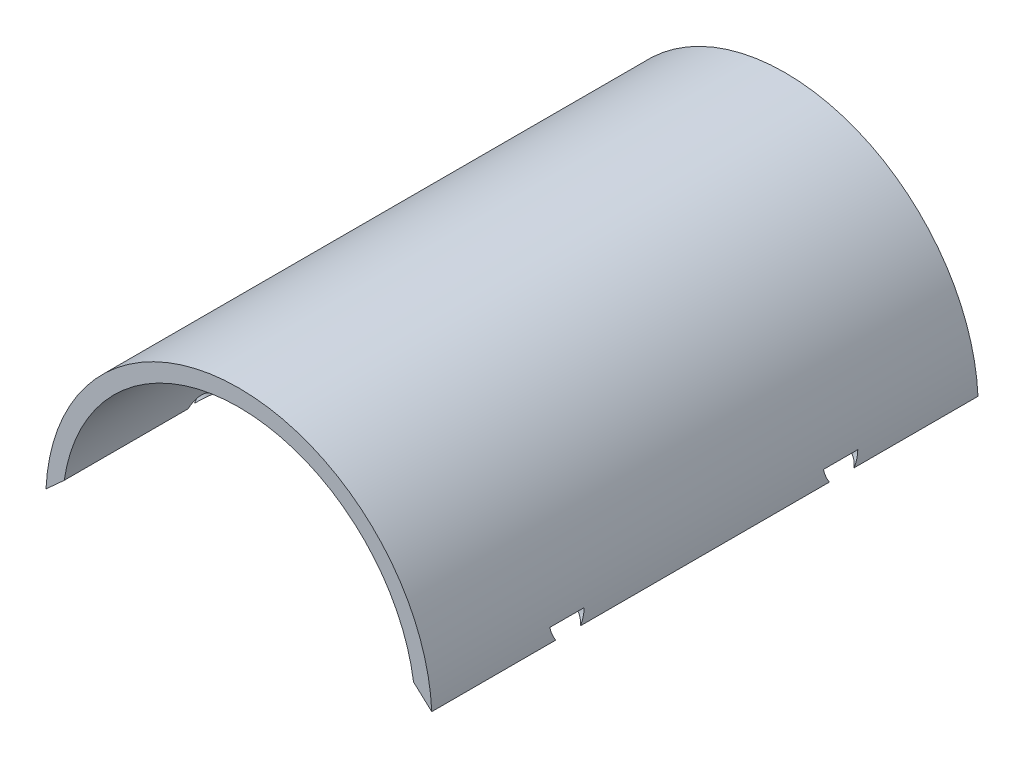
ISO-10303-21;
HEADER;
FILE_DESCRIPTION(('STEP AP214'),'2;1');
FILE_NAME('part.step','',(''),(''),'','','');
FILE_SCHEMA(('AUTOMOTIVE_DESIGN { 1 0 10303 214 1 1 1 1 }'));
ENDSEC;
DATA;
#1=APPLICATION_CONTEXT('core data for automotive mechanical design processes');
#2=APPLICATION_PROTOCOL_DEFINITION('international standard','automotive_design',2000,#1);
#3=PRODUCT_CONTEXT('',#1,'mechanical');
#4=PRODUCT('Part','Part','',(#3));
#5=PRODUCT_RELATED_PRODUCT_CATEGORY('part','',(#4));
#6=PRODUCT_DEFINITION_FORMATION('','',#4);
#7=PRODUCT_DEFINITION_CONTEXT('part definition',#1,'design');
#8=PRODUCT_DEFINITION('design','',#6,#7);
#9=PRODUCT_DEFINITION_SHAPE('','',#8);
#10=(LENGTH_UNIT() NAMED_UNIT(*) SI_UNIT(.MILLI.,.METRE.));
#11=(NAMED_UNIT(*) PLANE_ANGLE_UNIT() SI_UNIT($,.RADIAN.));
#12=(NAMED_UNIT(*) SI_UNIT($,.STERADIAN.) SOLID_ANGLE_UNIT());
#13=UNCERTAINTY_MEASURE_WITH_UNIT(LENGTH_MEASURE(1.E-05),#10,'distance_accuracy_value','');
#14=(GEOMETRIC_REPRESENTATION_CONTEXT(3) GLOBAL_UNCERTAINTY_ASSIGNED_CONTEXT((#13)) GLOBAL_UNIT_ASSIGNED_CONTEXT((#10,
#11,#12)) REPRESENTATION_CONTEXT('',''));
#15=CARTESIAN_POINT('',(0.,0.,0.));
#16=DIRECTION('',(0.,0.,1.));
#17=DIRECTION('',(1.,0.,0.));
#18=AXIS2_PLACEMENT_3D('',#15,#16,#17);
#19=CARTESIAN_POINT('',(40.2038837694651,5.93778829627168,125.73));
#20=DIRECTION('',(0.672307408747508,0.740272077106257,0.));
#21=DIRECTION('',(-0.740272077106257,0.672307408747508,0.));
#22=AXIS2_PLACEMENT_3D('',#19,#20,#21);
#23=PLANE('',#22);
#24=DIRECTION('',(0.,0.,-1.));
#25=VECTOR('',#24,1.);
#26=CARTESIAN_POINT('',(40.2038837694651,5.93778829627168,125.73));
#27=LINE('',#26,#25);
#28=CARTESIAN_POINT('',(40.2038837694651,5.93778829627169,91.5376801787406));
#29=VERTEX_POINT('',#28);
#30=CARTESIAN_POINT('',(40.2038837694651,5.93778829627169,34.1923198212594));
#31=VERTEX_POINT('',#30);
#32=EDGE_CURVE('E176',#29,#31,#27,.T.);
#33=ORIENTED_EDGE('',*,*,#32,.T.);
#34=CARTESIAN_POINT('',(42.3014633715025,4.03278829627168,31.369));
#35=DIRECTION('',(-0.672307408747507,-0.740272077106257,0.));
#36=DIRECTION('',(-0.740272077106257,0.672307408747507,0.));
#37=AXIS2_PLACEMENT_3D('',#34,#35,#36);
#38=CIRCLE('',#37,4.);
#39=CARTESIAN_POINT('',(44.39904297354,2.12778829627169,34.1923198212595));
#40=VERTEX_POINT('',#39);
#41=EDGE_CURVE('E158',#40,#31,#38,.T.);
#42=ORIENTED_EDGE('',*,*,#41,.F.);
#43=DIRECTION('',(0.,0.,-1.));
#44=VECTOR('',#43,1.);
#45=CARTESIAN_POINT('',(44.39904297354,2.12778829627168,125.73));
#46=LINE('',#45,#44);
#47=CARTESIAN_POINT('',(44.39904297354,2.12778829627169,91.5376801787405));
#48=VERTEX_POINT('',#47);
#49=EDGE_CURVE('E181',#48,#40,#46,.T.);
#50=ORIENTED_EDGE('',*,*,#49,.F.);
#51=CARTESIAN_POINT('',(42.3014633715025,4.03278829627169,94.361));
#52=DIRECTION('',(-0.672307408747507,-0.740272077106257,0.));
#53=DIRECTION('',(0.740272077106257,-0.672307408747507,0.));
#54=AXIS2_PLACEMENT_3D('',#51,#52,#53);
#55=CIRCLE('',#54,4.);
#56=EDGE_CURVE('E163',#29,#48,#55,.T.);
#57=ORIENTED_EDGE('',*,*,#56,.F.);
#58=EDGE_LOOP('',(#33,#42,#50,#57));
#59=FACE_BOUND('',#58,.T.);
#60=ADVANCED_FACE('F35',(#59),#23,.F.);
#61=CARTESIAN_POINT('',(40.2038837694651,5.93778829627168,125.73));
#62=VERTEX_POINT('',#61);
#63=CARTESIAN_POINT('',(40.2038837694651,5.93778829627169,97.1843198212594));
#64=VERTEX_POINT('',#63);
#65=EDGE_CURVE('E179',#62,#64,#27,.T.);
#66=ORIENTED_EDGE('',*,*,#65,.T.);
#67=CARTESIAN_POINT('',(44.39904297354,2.12778829627169,97.1843198212595));
#68=VERTEX_POINT('',#67);
#69=EDGE_CURVE('E241',#68,#64,#55,.T.);
#70=ORIENTED_EDGE('',*,*,#69,.F.);
#71=CARTESIAN_POINT('',(44.39904297354,2.12778829627168,125.73));
#72=VERTEX_POINT('',#71);
#73=EDGE_CURVE('E177',#72,#68,#46,.T.);
#74=ORIENTED_EDGE('',*,*,#73,.F.);
#75=DIRECTION('',(0.740272077106257,-0.672307408747507,0.));
#76=VECTOR('',#75,1.);
#77=CARTESIAN_POINT('',(40.2038837694651,5.93778829627168,125.73));
#78=LINE('',#77,#76);
#79=EDGE_CURVE('E306',#62,#72,#78,.T.);
#80=ORIENTED_EDGE('',*,*,#79,.F.);
#81=EDGE_LOOP('',(#66,#70,#74,#80));
#82=FACE_BOUND('',#81,.T.);
#83=ADVANCED_FACE('F353',(#82),#23,.F.);
#84=CARTESIAN_POINT('',(-40.2038837694651,5.93778829627168,125.73));
#85=DIRECTION('',(-0.672307408747508,0.740272077106257,0.));
#86=DIRECTION('',(-0.740272077106257,-0.672307408747508,0.));
#87=AXIS2_PLACEMENT_3D('',#84,#85,#86);
#88=PLANE('',#87);
#89=DIRECTION('',(0.,0.,-1.));
#90=VECTOR('',#89,1.);
#91=CARTESIAN_POINT('',(-44.39904297354,2.12778829627168,125.73));
#92=LINE('',#91,#90);
#93=CARTESIAN_POINT('',(-44.39904297354,2.12778829627169,91.5376801787406));
#94=VERTEX_POINT('',#93);
#95=CARTESIAN_POINT('',(-44.39904297354,2.12778829627169,34.1923198212594));
#96=VERTEX_POINT('',#95);
#97=EDGE_CURVE('E329',#94,#96,#92,.T.);
#98=ORIENTED_EDGE('',*,*,#97,.T.);
#99=CARTESIAN_POINT('',(-42.3014633715025,4.03278829627168,31.369));
#100=DIRECTION('',(-0.672307408747508,0.740272077106257,0.));
#101=DIRECTION('',(-0.740272077106257,-0.672307408747508,0.));
#102=AXIS2_PLACEMENT_3D('',#99,#100,#101);
#103=CIRCLE('',#102,4.);
#104=CARTESIAN_POINT('',(-40.2038837694651,5.93778829627169,34.1923198212594));
#105=VERTEX_POINT('',#104);
#106=EDGE_CURVE('E195',#96,#105,#103,.T.);
#107=ORIENTED_EDGE('',*,*,#106,.T.);
#108=DIRECTION('',(0.,0.,-1.));
#109=VECTOR('',#108,1.);
#110=CARTESIAN_POINT('',(-40.2038837694651,5.93778829627168,125.73));
#111=LINE('',#110,#109);
#112=CARTESIAN_POINT('',(-40.2038837694651,5.93778829627169,91.5376801787406));
#113=VERTEX_POINT('',#112);
#114=EDGE_CURVE('E326',#113,#105,#111,.T.);
#115=ORIENTED_EDGE('',*,*,#114,.F.);
#116=CARTESIAN_POINT('',(-42.3014633715025,4.03278829627168,94.361));
#117=DIRECTION('',(-0.672307408747508,0.740272077106257,0.));
#118=DIRECTION('',(-0.740272077106257,-0.672307408747508,0.));
#119=AXIS2_PLACEMENT_3D('',#116,#117,#118);
#120=CIRCLE('',#119,4.);
#121=EDGE_CURVE('E185',#113,#94,#120,.T.);
#122=ORIENTED_EDGE('',*,*,#121,.T.);
#123=EDGE_LOOP('',(#98,#107,#115,#122));
#124=FACE_BOUND('',#123,.T.);
#125=ADVANCED_FACE('F358',(#124),#88,.F.);
#126=CARTESIAN_POINT('',(-44.39904297354,2.12778829627168,125.73));
#127=VERTEX_POINT('',#126);
#128=CARTESIAN_POINT('',(-44.39904297354,2.12778829627169,97.1843198212594));
#129=VERTEX_POINT('',#128);
#130=EDGE_CURVE('E327',#127,#129,#92,.T.);
#131=ORIENTED_EDGE('',*,*,#130,.T.);
#132=CARTESIAN_POINT('',(-42.3014633715025,4.03278829627169,94.361));
#133=DIRECTION('',(0.672307408747507,-0.740272077106257,0.));
#134=DIRECTION('',(0.740272077106257,0.672307408747507,0.));
#135=AXIS2_PLACEMENT_3D('',#132,#133,#134);
#136=CIRCLE('',#135,4.);
#137=CARTESIAN_POINT('',(-40.2038837694651,5.93778829627169,97.1843198212594));
#138=VERTEX_POINT('',#137);
#139=EDGE_CURVE('E272',#138,#129,#136,.T.);
#140=ORIENTED_EDGE('',*,*,#139,.F.);
#141=CARTESIAN_POINT('',(-40.2038837694651,5.93778829627168,125.73));
#142=VERTEX_POINT('',#141);
#143=EDGE_CURVE('E322',#142,#138,#111,.T.);
#144=ORIENTED_EDGE('',*,*,#143,.F.);
#145=DIRECTION('',(0.740272077106257,0.672307408747507,0.));
#146=VECTOR('',#145,1.);
#147=CARTESIAN_POINT('',(-40.2038837694651,5.93778829627168,125.73));
#148=LINE('',#147,#146);
#149=EDGE_CURVE('E311',#127,#142,#148,.T.);
#150=ORIENTED_EDGE('',*,*,#149,.F.);
#151=EDGE_LOOP('',(#131,#140,#144,#150));
#152=FACE_BOUND('',#151,.T.);
#153=ADVANCED_FACE('F364',(#152),#88,.F.);
#154=CARTESIAN_POINT('',(0.,0.,125.73));
#155=DIRECTION('',(0.,0.,-1.));
#156=DIRECTION('',(-1.,0.,0.));
#157=AXIS2_PLACEMENT_3D('',#154,#155,#156);
#158=CYLINDRICAL_SURFACE('',#157,40.64);
#159=CARTESIAN_POINT('',(40.2038837694651,5.93778829627169,28.5456801787406));
#160=VERTEX_POINT('',#159);
#161=CARTESIAN_POINT('',(40.2038837694651,5.93778829627168,0.));
#162=VERTEX_POINT('',#161);
#163=EDGE_CURVE('E169',#160,#162,#27,.T.);
#164=ORIENTED_EDGE('',*,*,#163,.F.);
#165=CARTESIAN_POINT('',(40.2038837694651,5.93778829627169,28.5456801787406));
#166=CARTESIAN_POINT('',(40.1913132421633,6.02291585990196,28.6124510123841));
#167=CARTESIAN_POINT('',(40.1788118055654,6.10567612462736,28.6823090284335));
#168=CARTESIAN_POINT('',(40.1541531544196,6.26578865022539,28.8281564919255));
#169=CARTESIAN_POINT('',(40.141996254572,6.34313605606763,28.9041513154342));
#170=CARTESIAN_POINT('',(40.1181724615959,6.49211688683358,29.0626650040298));
#171=CARTESIAN_POINT('',(40.1065096054522,6.56370640806694,29.1452259066478));
#172=CARTESIAN_POINT('',(40.084010278307,6.69973661307581,29.3161383550986));
#173=CARTESIAN_POINT('',(40.0731736749685,6.76417844241918,29.404488969387));
#174=CARTESIAN_POINT('',(40.0525137129598,6.88545967671023,29.5871581372088));
#175=CARTESIAN_POINT('',(40.0426967734591,6.94225151658456,29.6815091010737));
#176=CARTESIAN_POINT('',(40.0244097045485,7.04691787405929,29.8751039358884));
#177=CARTESIAN_POINT('',(40.0159388212325,7.09479738591596,29.9743450268524));
#178=CARTESIAN_POINT('',(40.0005991194072,7.18077811889622,30.1767622636442));
#179=CARTESIAN_POINT('',(39.9937256904317,7.2189075129172,30.2799260593821));
#180=CARTESIAN_POINT('',(39.9817585070471,7.28489638060096,30.4895846116719));
#181=CARTESIAN_POINT('',(39.9766644580635,7.31275755419962,30.5960788136948));
#182=CARTESIAN_POINT('',(39.9688951209998,7.35509542875868,30.7989319276882));
#183=CARTESIAN_POINT('',(39.9660082465001,7.37074734269619,30.895038760085));
#184=CARTESIAN_POINT('',(39.9618273423075,7.3933814191251,31.0882982070598));
#185=CARTESIAN_POINT('',(39.9605331676218,7.40036437080397,31.1854507256303));
#186=CARTESIAN_POINT('',(39.959572741404,7.40554902528819,31.3800426896164));
#187=CARTESIAN_POINT('',(39.9599071437956,7.40374720073628,31.4774822345852));
#188=CARTESIAN_POINT('',(39.9621931505267,7.3913967508309,31.6717577855385));
#189=CARTESIAN_POINT('',(39.9641446988048,7.38084842869077,31.7685938123277));
#190=CARTESIAN_POINT('',(39.9719414920248,7.33855241593985,32.0423064206819));
#191=CARTESIAN_POINT('',(39.9796837595757,7.29642130763875,32.217631266668));
#192=CARTESIAN_POINT('',(39.999871326816,7.18491731329963,32.5588936292308));
#193=CARTESIAN_POINT('',(40.0123158095611,7.1155491592365,32.7248327706885));
#194=CARTESIAN_POINT('',(40.0415424936381,6.94923599022482,33.0508167729333));
#195=CARTESIAN_POINT('',(40.0584870977926,6.85124076692093,33.2103081757798));
#196=CARTESIAN_POINT('',(40.095192960951,6.63304538763827,33.5129532611374));
#197=CARTESIAN_POINT('',(40.1149555090133,6.51283506194855,33.6560994123058));
#198=CARTESIAN_POINT('',(40.1465702815048,6.31406979300912,33.8626060183779));
#199=CARTESIAN_POINT('',(40.1578673895727,6.24187114155976,33.9323169061829));
#200=CARTESIAN_POINT('',(40.1807169493678,6.09304946759938,34.0663146031002));
#201=CARTESIAN_POINT('',(40.1922684964993,6.01644092130683,34.1306176253914));
#202=CARTESIAN_POINT('',(40.2038837694651,5.93778829627169,34.1923198212594));
#203=B_SPLINE_CURVE_WITH_KNOTS('',3,(#165,#166,#167,#168,#169,#170,#171,#172,#173,#174,#175,
#176,#177,#178,#179,#180,#181,#182,#183,#184,#185,#186,#187,#188,#189,#190,#191,#192,#193,#194,
#195,#196,#197,#198,#199,#200,#201,#202),.UNSPECIFIED.,.F.,.F.,(4,2,2,2,2,2,2,2,2,2,2,2,2,2,2,2,
2,2,4),(0.,0.326735220214415,0.653759843865193,0.98307921047324,1.31234572023099,
1.64357330309617,1.97461471142324,2.30468848457324,2.63470758840893,2.92656284759353,
3.21839153549945,3.51033741122765,3.80227316654104,4.34104349743151,4.8797202674984,
5.44137750791956,6.00329250565084,6.3060655867425,6.6078959183745),.UNSPECIFIED.);
#204=EDGE_CURVE('E153',#160,#31,#203,.T.);
#205=ORIENTED_EDGE('',*,*,#204,.T.);
#206=ORIENTED_EDGE('',*,*,#32,.F.);
#207=CARTESIAN_POINT('',(40.2038837694651,5.93778829627169,91.5376801787406));
#208=CARTESIAN_POINT('',(40.1913132421633,6.02291585990196,91.6044510123841));
#209=CARTESIAN_POINT('',(40.1788118055654,6.10567612462736,91.6743090284335));
#210=CARTESIAN_POINT('',(40.1541531544196,6.26578865022539,91.8201564919255));
#211=CARTESIAN_POINT('',(40.141996254572,6.34313605606764,91.8961513154342));
#212=CARTESIAN_POINT('',(40.1181724615959,6.49211688683358,92.0546650040298));
#213=CARTESIAN_POINT('',(40.1065096054522,6.56370640806695,92.1372259066478));
#214=CARTESIAN_POINT('',(40.084010278307,6.69973661307581,92.3081383550985));
#215=CARTESIAN_POINT('',(40.0731736749685,6.76417844241919,92.396488969387));
#216=CARTESIAN_POINT('',(40.0525137129598,6.88545967671023,92.5791581372088));
#217=CARTESIAN_POINT('',(40.0426967734591,6.94225151658456,92.6735091010737));
#218=CARTESIAN_POINT('',(40.0244097045485,7.04691787405928,92.8671039358884));
#219=CARTESIAN_POINT('',(40.0159388212325,7.09479738591596,92.9663450268524));
#220=CARTESIAN_POINT('',(40.0005991194072,7.18077811889622,93.1687622636441));
#221=CARTESIAN_POINT('',(39.9937256904317,7.2189075129172,93.2719260593821));
#222=CARTESIAN_POINT('',(39.9817585070471,7.28489638060096,93.4815846116719));
#223=CARTESIAN_POINT('',(39.9766644580635,7.31275755419961,93.5880788136948));
#224=CARTESIAN_POINT('',(39.9688951209998,7.35509542875868,93.7909319276882));
#225=CARTESIAN_POINT('',(39.9660082465001,7.3707473426962,93.887038760085));
#226=CARTESIAN_POINT('',(39.9618273423075,7.3933814191251,94.0802982070598));
#227=CARTESIAN_POINT('',(39.9605331676218,7.40036437080397,94.1774507256303));
#228=CARTESIAN_POINT('',(39.959572741404,7.40554902528819,94.3720426896164));
#229=CARTESIAN_POINT('',(39.9599071437956,7.40374720073629,94.4694822345852));
#230=CARTESIAN_POINT('',(39.9621931505267,7.39139675083091,94.6637577855384));
#231=CARTESIAN_POINT('',(39.9641446988048,7.38084842869078,94.7605938123277));
#232=CARTESIAN_POINT('',(39.9719414920248,7.33855241593987,95.0343064206819));
#233=CARTESIAN_POINT('',(39.9796837595757,7.29642130763877,95.209631266668));
#234=CARTESIAN_POINT('',(39.999871326816,7.18491731329964,95.5508936292307));
#235=CARTESIAN_POINT('',(40.0123158095611,7.11554915923652,95.7168327706885));
#236=CARTESIAN_POINT('',(40.0415424936381,6.94923599022484,96.0428167729333));
#237=CARTESIAN_POINT('',(40.0584870977926,6.85124076692095,96.2023081757797));
#238=CARTESIAN_POINT('',(40.095192960951,6.63304538763829,96.5049532611374));
#239=CARTESIAN_POINT('',(40.1149555090133,6.51283506194857,96.6480994123058));
#240=CARTESIAN_POINT('',(40.1465702815048,6.31406979300913,96.8546060183779));
#241=CARTESIAN_POINT('',(40.1578673895727,6.24187114155977,96.9243169061829));
#242=CARTESIAN_POINT('',(40.1807169493678,6.09304946759939,97.0583146031002));
#243=CARTESIAN_POINT('',(40.1922684964993,6.01644092130683,97.1226176253914));
#244=CARTESIAN_POINT('',(40.2038837694651,5.93778829627168,97.1843198212594));
#245=B_SPLINE_CURVE_WITH_KNOTS('',3,(#207,#208,#209,#210,#211,#212,#213,#214,#215,#216,#217,
#218,#219,#220,#221,#222,#223,#224,#225,#226,#227,#228,#229,#230,#231,#232,#233,#234,#235,#236,
#237,#238,#239,#240,#241,#242,#243,#244),.UNSPECIFIED.,.F.,.F.,(4,2,2,2,2,2,2,2,2,2,2,2,2,2,2,2,
2,2,4),(0.,0.326735220214422,0.653759843865195,0.983079210473245,1.31234572023099,
1.64357330309616,1.97461471142323,2.30468848457322,2.63470758840892,2.92656284759354,
3.21839153549943,3.51033741122763,3.80227316654103,4.3410434974315,4.8797202674984,
5.44137750791955,6.00329250565084,6.3060655867425,6.60789591837453),.UNSPECIFIED.);
#246=EDGE_CURVE('E233',#29,#64,#245,.T.);
#247=ORIENTED_EDGE('',*,*,#246,.T.);
#248=ORIENTED_EDGE('',*,*,#65,.F.);
#249=CARTESIAN_POINT('',(0.,0.,125.73));
#250=DIRECTION('',(0.,0.,-1.));
#251=DIRECTION('',(1.,0.,0.));
#252=AXIS2_PLACEMENT_3D('',#249,#250,#251);
#253=CIRCLE('',#252,40.64);
#254=EDGE_CURVE('E303',#142,#62,#253,.T.);
#255=ORIENTED_EDGE('',*,*,#254,.F.);
#256=ORIENTED_EDGE('',*,*,#143,.T.);
#257=CARTESIAN_POINT('',(-40.2038837694651,5.93778829627169,97.1843198212594));
#258=CARTESIAN_POINT('',(-40.1913132421633,6.02291585990196,97.1175489876159));
#259=CARTESIAN_POINT('',(-40.1788118055654,6.10567612462736,97.0476909715665));
#260=CARTESIAN_POINT('',(-40.1541531544196,6.26578865022539,96.9018435080745));
#261=CARTESIAN_POINT('',(-40.141996254572,6.34313605606764,96.8258486845658));
#262=CARTESIAN_POINT('',(-40.1181724615959,6.49211688683358,96.6673349959702));
#263=CARTESIAN_POINT('',(-40.1065096054522,6.56370640806695,96.5847740933522));
#264=CARTESIAN_POINT('',(-40.084010278307,6.69973661307581,96.4138616449015));
#265=CARTESIAN_POINT('',(-40.0731736749685,6.76417844241919,96.325511030613));
#266=CARTESIAN_POINT('',(-40.0525137129598,6.88545967671024,96.1428418627912));
#267=CARTESIAN_POINT('',(-40.0426967734591,6.94225151658457,96.0484908989263));
#268=CARTESIAN_POINT('',(-40.0244097045485,7.04691787405929,95.8548960641116));
#269=CARTESIAN_POINT('',(-40.0159388212325,7.09479738591596,95.7556549731476));
#270=CARTESIAN_POINT('',(-40.0005991194072,7.18077811889623,95.5532377363558));
#271=CARTESIAN_POINT('',(-39.9937256904317,7.21890751291721,95.4500739406179));
#272=CARTESIAN_POINT('',(-39.9817585070471,7.28489638060096,95.2404153883281));
#273=CARTESIAN_POINT('',(-39.9766644580635,7.31275755419962,95.1339211863052));
#274=CARTESIAN_POINT('',(-39.9688951209998,7.35509542875869,94.9310680723118));
#275=CARTESIAN_POINT('',(-39.9660082465001,7.3707473426962,94.834961239915));
#276=CARTESIAN_POINT('',(-39.9618273423075,7.3933814191251,94.6417017929402));
#277=CARTESIAN_POINT('',(-39.9605331676218,7.40036437080397,94.5445492743697));
#278=CARTESIAN_POINT('',(-39.959572741404,7.40554902528819,94.3499573103836));
#279=CARTESIAN_POINT('',(-39.9599071437956,7.40374720073629,94.2525177654148));
#280=CARTESIAN_POINT('',(-39.9621931505267,7.39139675083091,94.0582422144615));
#281=CARTESIAN_POINT('',(-39.9641446988048,7.38084842869077,93.9614061876723));
#282=CARTESIAN_POINT('',(-39.9719414920248,7.33855241593986,93.6876935793181));
#283=CARTESIAN_POINT('',(-39.9796837595757,7.29642130763876,93.512368733332));
#284=CARTESIAN_POINT('',(-39.999871326816,7.18491731329964,93.1711063707692));
#285=CARTESIAN_POINT('',(-40.0123158095611,7.11554915923651,93.0051672293115));
#286=CARTESIAN_POINT('',(-40.0415424936381,6.94923599022483,92.6791832270667));
#287=CARTESIAN_POINT('',(-40.0584870977926,6.85124076692094,92.5196918242202));
#288=CARTESIAN_POINT('',(-40.095192960951,6.63304538763828,92.2170467388626));
#289=CARTESIAN_POINT('',(-40.1149555090133,6.51283506194856,92.0739005876942));
#290=CARTESIAN_POINT('',(-40.1465702815048,6.31406979300911,91.8673939816221));
#291=CARTESIAN_POINT('',(-40.1578673895727,6.24187114155975,91.7976830938171));
#292=CARTESIAN_POINT('',(-40.1807169493678,6.09304946759937,91.6636853968998));
#293=CARTESIAN_POINT('',(-40.1922684964993,6.01644092130682,91.5993823746086));
#294=CARTESIAN_POINT('',(-40.2038837694651,5.93778829627168,91.5376801787406));
#295=B_SPLINE_CURVE_WITH_KNOTS('',3,(#257,#258,#259,#260,#261,#262,#263,#264,#265,#266,#267,
#268,#269,#270,#271,#272,#273,#274,#275,#276,#277,#278,#279,#280,#281,#282,#283,#284,#285,#286,
#287,#288,#289,#290,#291,#292,#293,#294),.UNSPECIFIED.,.F.,.F.,(4,2,2,2,2,2,2,2,2,2,2,2,2,2,2,2,
2,2,4),(0.,0.326735220214423,0.653759843865196,0.983079210473245,1.312345720231,
1.64357330309619,1.97461471142326,2.30468848457324,2.63470758840895,2.92656284759354,
3.21839153549946,3.51033741122766,3.80227316654106,4.34104349743153,4.87972026749841,
5.44137750791958,6.00329250565086,6.30606558674253,6.60789591837453),.UNSPECIFIED.);
#296=EDGE_CURVE('E297',#138,#113,#295,.T.);
#297=ORIENTED_EDGE('',*,*,#296,.T.);
#298=ORIENTED_EDGE('',*,*,#114,.T.);
#299=CARTESIAN_POINT('',(-40.2038837694651,5.93778829627169,34.1923198212594));
#300=CARTESIAN_POINT('',(-40.1913132421633,6.02291585990196,34.1255489876159));
#301=CARTESIAN_POINT('',(-40.1788118055654,6.10567612462736,34.0556909715666));
#302=CARTESIAN_POINT('',(-40.1541531544196,6.26578865022539,33.9098435080745));
#303=CARTESIAN_POINT('',(-40.141996254572,6.34313605606763,33.8338486845658));
#304=CARTESIAN_POINT('',(-40.1181724615959,6.49211688683358,33.6753349959702));
#305=CARTESIAN_POINT('',(-40.1065096054522,6.56370640806695,33.5927740933522));
#306=CARTESIAN_POINT('',(-40.084010278307,6.69973661307581,33.4218616449015));
#307=CARTESIAN_POINT('',(-40.0731736749685,6.76417844241919,33.333511030613));
#308=CARTESIAN_POINT('',(-40.0525137129598,6.88545967671024,33.1508418627912));
#309=CARTESIAN_POINT('',(-40.0426967734591,6.94225151658456,33.0564908989263));
#310=CARTESIAN_POINT('',(-40.0244097045485,7.04691787405929,32.8628960641116));
#311=CARTESIAN_POINT('',(-40.0159388212325,7.09479738591596,32.7636549731476));
#312=CARTESIAN_POINT('',(-40.0005991194072,7.18077811889622,32.5612377363558));
#313=CARTESIAN_POINT('',(-39.9937256904317,7.2189075129172,32.4580739406179));
#314=CARTESIAN_POINT('',(-39.9817585070471,7.28489638060096,32.2484153883281));
#315=CARTESIAN_POINT('',(-39.9766644580635,7.31275755419962,32.1419211863052));
#316=CARTESIAN_POINT('',(-39.9688951209998,7.35509542875869,31.9390680723118));
#317=CARTESIAN_POINT('',(-39.9660082465001,7.3707473426962,31.842961239915));
#318=CARTESIAN_POINT('',(-39.9618273423075,7.3933814191251,31.6497017929402));
#319=CARTESIAN_POINT('',(-39.9605331676218,7.40036437080397,31.5525492743697));
#320=CARTESIAN_POINT('',(-39.959572741404,7.40554902528819,31.3579573103836));
#321=CARTESIAN_POINT('',(-39.9599071437956,7.40374720073629,31.2605177654148));
#322=CARTESIAN_POINT('',(-39.9621931505267,7.39139675083091,31.0662422144615));
#323=CARTESIAN_POINT('',(-39.9641446988048,7.38084842869077,30.9694061876723));
#324=CARTESIAN_POINT('',(-39.9719414920248,7.33855241593986,30.6956935793181));
#325=CARTESIAN_POINT('',(-39.9796837595757,7.29642130763876,30.520368733332));
#326=CARTESIAN_POINT('',(-39.999871326816,7.18491731329964,30.1791063707692));
#327=CARTESIAN_POINT('',(-40.0123158095611,7.11554915923651,30.0131672293115));
#328=CARTESIAN_POINT('',(-40.0415424936381,6.94923599022483,29.6871832270667));
#329=CARTESIAN_POINT('',(-40.0584870977926,6.85124076692094,29.5276918242203));
#330=CARTESIAN_POINT('',(-40.095192960951,6.63304538763828,29.2250467388627));
#331=CARTESIAN_POINT('',(-40.1149555090133,6.51283506194856,29.0819005876942));
#332=CARTESIAN_POINT('',(-40.1465702815048,6.31406979300912,28.8753939816221));
#333=CARTESIAN_POINT('',(-40.1578673895727,6.24187114155976,28.8056830938171));
#334=CARTESIAN_POINT('',(-40.1807169493678,6.09304946759938,28.6716853968998));
#335=CARTESIAN_POINT('',(-40.1922684964993,6.01644092130683,28.6073823746086));
#336=CARTESIAN_POINT('',(-40.2038837694651,5.93778829627169,28.5456801787406));
#337=B_SPLINE_CURVE_WITH_KNOTS('',3,(#299,#300,#301,#302,#303,#304,#305,#306,#307,#308,#309,
#310,#311,#312,#313,#314,#315,#316,#317,#318,#319,#320,#321,#322,#323,#324,#325,#326,#327,#328,
#329,#330,#331,#332,#333,#334,#335,#336),.UNSPECIFIED.,.F.,.F.,(4,2,2,2,2,2,2,2,2,2,2,2,2,2,2,2,
2,2,4),(0.,0.32673522021441,0.653759843865189,0.983079210473241,1.31234572023099,
1.64357330309617,1.97461471142324,2.30468848457324,2.63470758840893,2.92656284759354,
3.21839153549946,3.51033741122766,3.80227316654104,4.34104349743152,4.8797202674984,
5.44137750791956,6.00329250565084,6.30606558674251,6.60789591837452),.UNSPECIFIED.);
#338=CARTESIAN_POINT('',(-40.2038837694651,5.93778829627169,28.5456801787406));
#339=VERTEX_POINT('',#338);
#340=EDGE_CURVE('E266',#105,#339,#337,.T.);
#341=ORIENTED_EDGE('',*,*,#340,.T.);
#342=CARTESIAN_POINT('',(-40.2038837694651,5.93778829627168,0.));
#343=VERTEX_POINT('',#342);
#344=EDGE_CURVE('E313',#339,#343,#111,.T.);
#345=ORIENTED_EDGE('',*,*,#344,.T.);
#346=CARTESIAN_POINT('',(0.,0.,0.));
#347=DIRECTION('',(0.,0.,-1.));
#348=DIRECTION('',(1.,0.,0.));
#349=AXIS2_PLACEMENT_3D('',#346,#347,#348);
#350=CIRCLE('',#349,40.64);
#351=EDGE_CURVE('E175',#343,#162,#350,.T.);
#352=ORIENTED_EDGE('',*,*,#351,.T.);
#353=EDGE_LOOP('',(#164,#205,#206,#247,#248,#255,#256,#297,#298,#341,#345,#352));
#354=FACE_BOUND('',#353,.T.);
#355=ADVANCED_FACE('F37',(#354),#158,.F.);
#356=CARTESIAN_POINT('',(44.39904297354,2.12778829627169,28.5456801787405));
#357=VERTEX_POINT('',#356);
#358=CARTESIAN_POINT('',(44.39904297354,2.12778829627168,0.));
#359=VERTEX_POINT('',#358);
#360=EDGE_CURVE('E171',#357,#359,#46,.T.);
#361=ORIENTED_EDGE('',*,*,#360,.F.);
#362=EDGE_CURVE('E156',#160,#357,#38,.T.);
#363=ORIENTED_EDGE('',*,*,#362,.F.);
#364=ORIENTED_EDGE('',*,*,#163,.T.);
#365=DIRECTION('',(0.740272077106257,-0.672307408747507,0.));
#366=VECTOR('',#365,1.);
#367=CARTESIAN_POINT('',(40.2038837694651,5.93778829627168,0.));
#368=LINE('',#367,#366);
#369=EDGE_CURVE('E315',#162,#359,#368,.T.);
#370=ORIENTED_EDGE('',*,*,#369,.T.);
#371=EDGE_LOOP('',(#361,#363,#364,#370));
#372=FACE_BOUND('',#371,.T.);
#373=ADVANCED_FACE('F167',(#372),#23,.F.);
#374=CARTESIAN_POINT('',(0.,0.,125.73));
#375=DIRECTION('',(0.,0.,-1.));
#376=DIRECTION('',(-1.,0.,0.));
#377=AXIS2_PLACEMENT_3D('',#374,#375,#376);
#378=CYLINDRICAL_SURFACE('',#377,44.45);
#379=DIRECTION('',(0.,0.,-1.));
#380=VECTOR('',#379,1.);
#381=CARTESIAN_POINT('',(44.1573519531417,5.09222627996518,125.73));
#382=LINE('',#381,#380);
#383=CARTESIAN_POINT('',(44.1573519531417,5.09222627996519,35.3139071891806));
#384=VERTEX_POINT('',#383);
#385=CARTESIAN_POINT('',(44.1573519531417,5.09222627996519,27.4240928108194));
#386=VERTEX_POINT('',#385);
#387=EDGE_CURVE('E499',#384,#386,#382,.T.);
#388=ORIENTED_EDGE('',*,*,#387,.T.);
#389=CARTESIAN_POINT('',(44.1573519531418,5.09222627996519,27.4240928108194));
#390=CARTESIAN_POINT('',(44.1767528055744,4.92405310719916,27.4454833665248));
#391=CARTESIAN_POINT('',(44.1950912633303,4.7565287169981,27.472977608075));
#392=CARTESIAN_POINT('',(44.2296521315227,4.423599569495,27.540116512387));
#393=CARTESIAN_POINT('',(44.2458731794095,4.25819623821371,27.5797689445048));
#394=CARTESIAN_POINT('',(44.2758960409551,3.93365229082651,27.6702742866196));
#395=CARTESIAN_POINT('',(44.2897378608018,3.77445239298207,27.7209008017688));
#396=CARTESIAN_POINT('',(44.3154006005844,3.46014768191094,27.8338018077849));
#397=CARTESIAN_POINT('',(44.3272223256067,3.305041258213,27.8960716375199));
#398=CARTESIAN_POINT('',(44.3507538053516,2.97406743658683,28.0440254996786));
#399=CARTESIAN_POINT('',(44.3621054428183,2.79913341688546,28.1318889293427));
#400=CARTESIAN_POINT('',(44.3772950226347,2.54276406296363,28.2766682657638));
#401=CARTESIAN_POINT('',(44.3820733002986,2.45785675655623,28.3274119790874));
#402=CARTESIAN_POINT('',(44.3910139155505,2.29072052286326,28.43325717194));
#403=CARTESIAN_POINT('',(44.3951759847201,2.20849277487632,28.4883605345756));
#404=CARTESIAN_POINT('',(44.39904297354,2.12778829627169,28.5456801787405));
#405=B_SPLINE_CURVE_WITH_KNOTS('',3,(#389,#390,#391,#392,#393,#394,#395,#396,#397,#398,#399,
#400,#401,#402,#403,#404),.UNSPECIFIED.,.F.,.F.,(4,2,2,2,2,2,2,4),(0.,0.511797613926147,
1.02392296200671,1.52634730403807,2.02857094105637,2.61586016227984,2.91283485033906,
3.20993852137294),.UNSPECIFIED.);
#406=EDGE_CURVE('E11',#386,#357,#405,.T.);
#407=ORIENTED_EDGE('',*,*,#406,.T.);
#408=ORIENTED_EDGE('',*,*,#360,.T.);
#409=CARTESIAN_POINT('',(0.,0.,0.));
#410=DIRECTION('',(0.,0.,1.));
#411=DIRECTION('',(1.,0.,0.));
#412=AXIS2_PLACEMENT_3D('',#409,#410,#411);
#413=CIRCLE('',#412,44.45);
#414=CARTESIAN_POINT('',(-44.39904297354,2.12778829627168,0.));
#415=VERTEX_POINT('',#414);
#416=EDGE_CURVE('E317',#359,#415,#413,.T.);
#417=ORIENTED_EDGE('',*,*,#416,.T.);
#418=CARTESIAN_POINT('',(-44.39904297354,2.12778829627169,28.5456801787406));
#419=VERTEX_POINT('',#418);
#420=EDGE_CURVE('E325',#419,#415,#92,.T.);
#421=ORIENTED_EDGE('',*,*,#420,.F.);
#422=CARTESIAN_POINT('',(-44.39904297354,2.12778829627169,28.5456801787406));
#423=CARTESIAN_POINT('',(-44.3923544121857,2.26755422855096,28.4464648839044));
#424=CARTESIAN_POINT('',(-44.3847697444573,2.4118290474382,28.3538491723727));
#425=CARTESIAN_POINT('',(-44.3676992322139,2.70766808373904,28.1815195523055));
#426=CARTESIAN_POINT('',(-44.3582146804163,2.85922729170752,28.1017969373645));
#427=CARTESIAN_POINT('',(-44.3374132457908,3.16535500446614,27.9561290720843));
#428=CARTESIAN_POINT('',(-44.3261319375629,3.31982210178387,27.8899640758075));
#429=CARTESIAN_POINT('',(-44.3015526560469,3.63312860846837,27.7694645585049));
#430=CARTESIAN_POINT('',(-44.2882547656636,3.79196783787065,27.7151295513541));
#431=CARTESIAN_POINT('',(-44.258059245395,4.13018844143038,27.612989540617));
#432=CARTESIAN_POINT('',(-44.2409286505058,4.3099485525261,27.566506303486));
#433=CARTESIAN_POINT('',(-44.2039449863492,4.67416719068073,27.4875821480094));
#434=CARTESIAN_POINT('',(-44.184066246256,4.858654798891,27.4552873030421));
#435=CARTESIAN_POINT('',(-44.1628902552898,5.04396910173191,27.4303957630929));
#436=B_SPLINE_CURVE_WITH_KNOTS('',3,(#422,#423,#424,#425,#426,#427,#428,#429,#430,#431,#432,
#433,#434,#435),.UNSPECIFIED.,.F.,.F.,(4,2,2,2,2,2,4),(0.,0.514248289297658,1.02814785559117,
1.53291089918042,2.03765319683236,2.59643000698799,3.16083196864485),.UNSPECIFIED.);
#437=CARTESIAN_POINT('',(-44.1628902552898,5.04396910173191,27.4303957630929));
#438=VERTEX_POINT('',#437);
#439=EDGE_CURVE('E246',#419,#438,#436,.T.);
#440=ORIENTED_EDGE('',*,*,#439,.T.);
#441=DIRECTION('',(0.,0.,-1.));
#442=VECTOR('',#441,1.);
#443=CARTESIAN_POINT('',(-44.1628902552898,5.04396910173191,125.73));
#444=LINE('',#443,#442);
#445=CARTESIAN_POINT('',(-44.1628902552898,5.04396910173191,35.3076042369071));
#446=VERTEX_POINT('',#445);
#447=EDGE_CURVE('E200',#438,#446,#444,.F.);
#448=ORIENTED_EDGE('',*,*,#447,.T.);
#449=CARTESIAN_POINT('',(-44.1628902552898,5.04396910173191,35.3076042369071));
#450=CARTESIAN_POINT('',(-44.1820882207202,4.87594230518135,35.2850410497049));
#451=CARTESIAN_POINT('',(-44.2002218425883,4.70860522803789,35.256385663469));
#452=CARTESIAN_POINT('',(-44.2343731536034,4.3761296412425,35.1869341990871));
#453=CARTESIAN_POINT('',(-44.2503893669069,4.210992736462,35.146129716719));
#454=CARTESIAN_POINT('',(-44.2800115624876,3.88703907732062,35.0533337320402));
#455=CARTESIAN_POINT('',(-44.2936571173332,3.72816187528311,35.0015664120568));
#456=CARTESIAN_POINT('',(-44.3189313479414,3.41460828009224,34.8863699251293));
#457=CARTESIAN_POINT('',(-44.330560895291,3.25993009608057,34.8229458223566));
#458=CARTESIAN_POINT('',(-44.3531677738895,2.93737590671439,34.6758156910253));
#459=CARTESIAN_POINT('',(-44.363895738379,2.77016886967959,34.5905838852114));
#460=CARTESIAN_POINT('',(-44.3783028882209,2.52498528170086,34.4507838004631));
#461=CARTESIAN_POINT('',(-44.3828439396484,2.44378091214643,34.4019008381603));
#462=CARTESIAN_POINT('',(-44.3913614431513,2.2838462581787,34.3001311513064));
#463=CARTESIAN_POINT('',(-44.3953376652043,2.2051169918373,34.2472428089611));
#464=CARTESIAN_POINT('',(-44.39904297354,2.12778829627169,34.1923198212595));
#465=B_SPLINE_CURVE_WITH_KNOTS('',3,(#449,#450,#451,#452,#453,#454,#455,#456,#457,#458,#459,
#460,#461,#462,#463,#464),.UNSPECIFIED.,.F.,.F.,(4,2,2,2,2,2,2,4),(0.,0.511752184475264,
1.02385920285529,1.52636097799274,2.02864496014022,2.59173143963583,2.87630157654165,
3.16098727221964),.UNSPECIFIED.);
#466=EDGE_CURVE('E253',#446,#96,#465,.T.);
#467=ORIENTED_EDGE('',*,*,#466,.T.);
#468=ORIENTED_EDGE('',*,*,#97,.F.);
#469=CARTESIAN_POINT('',(-44.39904297354,2.12778829627169,91.5376801787406));
#470=CARTESIAN_POINT('',(-44.3923544121857,2.26755422855096,91.4384648839044));
#471=CARTESIAN_POINT('',(-44.3847697444573,2.4118290474382,91.3458491723727));
#472=CARTESIAN_POINT('',(-44.3676992322139,2.70766808373904,91.1735195523055));
#473=CARTESIAN_POINT('',(-44.3582146804163,2.85922729170752,91.0937969373645));
#474=CARTESIAN_POINT('',(-44.3374132457908,3.16535500446613,90.9481290720843));
#475=CARTESIAN_POINT('',(-44.3261319375629,3.31982210178387,90.8819640758075));
#476=CARTESIAN_POINT('',(-44.3015526560469,3.63312860846836,90.7614645585049));
#477=CARTESIAN_POINT('',(-44.2882547656636,3.79196783787064,90.707129551354));
#478=CARTESIAN_POINT('',(-44.258059245395,4.13018844143037,90.604989540617));
#479=CARTESIAN_POINT('',(-44.2409286505058,4.30994855252609,90.558506303486));
#480=CARTESIAN_POINT('',(-44.2039449863492,4.67416719068072,90.4795821480094));
#481=CARTESIAN_POINT('',(-44.1840662462561,4.858654798891,90.4472873030421));
#482=CARTESIAN_POINT('',(-44.1628902552898,5.04396910173191,90.4223957630929));
#483=B_SPLINE_CURVE_WITH_KNOTS('',3,(#469,#470,#471,#472,#473,#474,#475,#476,#477,#478,#479,
#480,#481,#482),.UNSPECIFIED.,.F.,.F.,(4,2,2,2,2,2,4),(0.,0.514248289297653,1.02814785559117,
1.53291089918042,2.03765319683236,2.59643000698798,3.16083196864485),.UNSPECIFIED.);
#484=CARTESIAN_POINT('',(-44.1628902552898,5.04396910173191,90.4223957630929));
#485=VERTEX_POINT('',#484);
#486=EDGE_CURVE('E276',#94,#485,#483,.T.);
#487=ORIENTED_EDGE('',*,*,#486,.T.);
#488=DIRECTION('',(0.,0.,-1.));
#489=VECTOR('',#488,1.);
#490=CARTESIAN_POINT('',(-44.1628902552898,5.04396910173191,125.73));
#491=LINE('',#490,#489);
#492=CARTESIAN_POINT('',(-44.1628902552898,5.04396910173191,98.2996042369071));
#493=VERTEX_POINT('',#492);
#494=EDGE_CURVE('E190',#493,#485,#491,.T.);
#495=ORIENTED_EDGE('',*,*,#494,.F.);
#496=CARTESIAN_POINT('',(-44.1628902552898,5.04396910173191,98.2996042369071));
#497=CARTESIAN_POINT('',(-44.1820882207202,4.87594230518135,98.2770410497049));
#498=CARTESIAN_POINT('',(-44.2002218425883,4.70860522803789,98.248385663469));
#499=CARTESIAN_POINT('',(-44.2343731536034,4.3761296412425,98.1789341990871));
#500=CARTESIAN_POINT('',(-44.2503893669069,4.210992736462,98.138129716719));
#501=CARTESIAN_POINT('',(-44.2800115624876,3.88703907732061,98.0453337320402));
#502=CARTESIAN_POINT('',(-44.2936571173332,3.72816187528311,97.9935664120568));
#503=CARTESIAN_POINT('',(-44.3189313479414,3.41460828009223,97.8783699251293));
#504=CARTESIAN_POINT('',(-44.330560895291,3.25993009608056,97.8149458223566));
#505=CARTESIAN_POINT('',(-44.3531677738895,2.93737590671439,97.6678156910253));
#506=CARTESIAN_POINT('',(-44.363895738379,2.7701688696796,97.5825838852114));
#507=CARTESIAN_POINT('',(-44.3783028882209,2.52498528170086,97.4427838004631));
#508=CARTESIAN_POINT('',(-44.3828439396484,2.44378091214643,97.3939008381602));
#509=CARTESIAN_POINT('',(-44.3913614431513,2.28384625817869,97.2921311513064));
#510=CARTESIAN_POINT('',(-44.3953376652043,2.2051169918373,97.2392428089611));
#511=CARTESIAN_POINT('',(-44.39904297354,2.12778829627169,97.1843198212594));
#512=B_SPLINE_CURVE_WITH_KNOTS('',3,(#496,#497,#498,#499,#500,#501,#502,#503,#504,#505,#506,
#507,#508,#509,#510,#511),.UNSPECIFIED.,.F.,.F.,(4,2,2,2,2,2,2,4),(0.,0.511752184475261,
1.02385920285529,1.52636097799274,2.02864496014022,2.59173143963583,2.87630157654165,
3.16098727221964),.UNSPECIFIED.);
#513=EDGE_CURVE('E283',#493,#129,#512,.T.);
#514=ORIENTED_EDGE('',*,*,#513,.T.);
#515=ORIENTED_EDGE('',*,*,#130,.F.);
#516=CARTESIAN_POINT('',(0.,0.,125.73));
#517=DIRECTION('',(0.,0.,1.));
#518=DIRECTION('',(1.,0.,0.));
#519=AXIS2_PLACEMENT_3D('',#516,#517,#518);
#520=CIRCLE('',#519,44.45);
#521=EDGE_CURVE('E309',#72,#127,#520,.T.);
#522=ORIENTED_EDGE('',*,*,#521,.F.);
#523=ORIENTED_EDGE('',*,*,#73,.T.);
#524=CARTESIAN_POINT('',(44.39904297354,2.12778829627168,97.1843198212595));
#525=CARTESIAN_POINT('',(44.3923534990874,2.26757306498648,97.2835484428421));
#526=CARTESIAN_POINT('',(44.3847677056308,2.4118677381151,97.3761756418802));
#527=CARTESIAN_POINT('',(44.3676945758033,2.70774546235265,97.5485232336858));
#528=CARTESIAN_POINT('',(44.3582085680161,2.85932336523158,97.6282525743093));
#529=CARTESIAN_POINT('',(44.3374062911636,3.16545132257121,97.7739130349238));
#530=CARTESIAN_POINT('',(44.3261260953405,3.31989855324287,97.8400669676156));
#531=CARTESIAN_POINT('',(44.3015495996573,3.6331655846569,97.9605480224109));
#532=CARTESIAN_POINT('',(44.2882533456222,3.79198528594582,98.0148754132637));
#533=CARTESIAN_POINT('',(44.2573724863691,4.13787906115518,98.1193333189591));
#534=CARTESIAN_POINT('',(44.2394426142766,4.32551502161195,98.1675062001104));
#535=CARTESIAN_POINT('',(44.2006162763786,4.70587434134289,98.2485596422657));
#536=CARTESIAN_POINT('',(44.1796902450215,4.89863060137545,98.281271844733));
#537=CARTESIAN_POINT('',(44.1573519531417,5.09222627996518,98.3059071891806));
#538=B_SPLINE_CURVE_WITH_KNOTS('',3,(#524,#525,#526,#527,#528,#529,#530,#531,#532,#533,#534,
#535,#536,#537),.UNSPECIFIED.,.F.,.F.,(4,2,2,2,2,2,4),(0.,0.514317068786363,1.02827578693068,
1.53297021633472,2.03765317574553,2.62060761797781,3.20977164811851),.UNSPECIFIED.);
#539=CARTESIAN_POINT('',(44.1573519531417,5.09222627996519,98.3059071891806));
#540=VERTEX_POINT('',#539);
#541=EDGE_CURVE('E212',#68,#540,#538,.T.);
#542=ORIENTED_EDGE('',*,*,#541,.T.);
#543=DIRECTION('',(0.,0.,-1.));
#544=VECTOR('',#543,1.);
#545=CARTESIAN_POINT('',(44.1573519531417,5.09222627996518,125.73));
#546=LINE('',#545,#544);
#547=CARTESIAN_POINT('',(44.1573519531417,5.09222627996519,90.4160928108194));
#548=VERTEX_POINT('',#547);
#549=EDGE_CURVE('E203',#548,#540,#546,.F.);
#550=ORIENTED_EDGE('',*,*,#549,.F.);
#551=CARTESIAN_POINT('',(44.1573519531418,5.09222627996518,90.4160928108194));
#552=CARTESIAN_POINT('',(44.1767528055744,4.92405310719916,90.4374833665248));
#553=CARTESIAN_POINT('',(44.1950912633304,4.75652871699809,90.464977608075));
#554=CARTESIAN_POINT('',(44.2296521315227,4.423599569495,90.532116512387));
#555=CARTESIAN_POINT('',(44.2458731794095,4.25819623821371,90.5717689445048));
#556=CARTESIAN_POINT('',(44.2758960409551,3.9336522908265,90.6622742866196));
#557=CARTESIAN_POINT('',(44.2897378608018,3.77445239298206,90.7129008017688));
#558=CARTESIAN_POINT('',(44.3154006005844,3.46014768191094,90.8258018077849));
#559=CARTESIAN_POINT('',(44.3272223256067,3.305041258213,90.8880716375199));
#560=CARTESIAN_POINT('',(44.3507538053516,2.97406743658682,91.0360254996786));
#561=CARTESIAN_POINT('',(44.3621054428183,2.79913341688546,91.1238889293427));
#562=CARTESIAN_POINT('',(44.3772950226347,2.54276406296363,91.2686682657638));
#563=CARTESIAN_POINT('',(44.3820733002986,2.45785675655623,91.3194119790874));
#564=CARTESIAN_POINT('',(44.3910139155505,2.29072052286326,91.42525717194));
#565=CARTESIAN_POINT('',(44.3951759847201,2.20849277487631,91.4803605345756));
#566=CARTESIAN_POINT('',(44.39904297354,2.12778829627169,91.5376801787405));
#567=B_SPLINE_CURVE_WITH_KNOTS('',3,(#551,#552,#553,#554,#555,#556,#557,#558,#559,#560,#561,
#562,#563,#564,#565,#566),.UNSPECIFIED.,.F.,.F.,(4,2,2,2,2,2,2,4),(0.,0.511797613926148,
1.02392296200671,1.52634730403807,2.02857094105636,2.61586016227985,2.91283485033906,
3.20993852137294),.UNSPECIFIED.);
#568=EDGE_CURVE('E205',#548,#48,#567,.T.);
#569=ORIENTED_EDGE('',*,*,#568,.T.);
#570=ORIENTED_EDGE('',*,*,#49,.T.);
#571=CARTESIAN_POINT('',(44.39904297354,2.12778829627169,34.1923198212595));
#572=CARTESIAN_POINT('',(44.3923534990874,2.26757306498648,34.2915484428422));
#573=CARTESIAN_POINT('',(44.3847677056307,2.4118677381151,34.3841756418803));
#574=CARTESIAN_POINT('',(44.3676945758033,2.70774546235265,34.5565232336858));
#575=CARTESIAN_POINT('',(44.3582085680161,2.85932336523159,34.6362525743093));
#576=CARTESIAN_POINT('',(44.3374062911636,3.16545132257122,34.7819130349238));
#577=CARTESIAN_POINT('',(44.3261260953405,3.31989855324288,34.8480669676156));
#578=CARTESIAN_POINT('',(44.3015495996573,3.63316558465691,34.9685480224109));
#579=CARTESIAN_POINT('',(44.2882533456222,3.79198528594582,35.0228754132637));
#580=CARTESIAN_POINT('',(44.2573724863691,4.13787906115518,35.1273333189591));
#581=CARTESIAN_POINT('',(44.2394426142766,4.32551502161195,35.1755062001104));
#582=CARTESIAN_POINT('',(44.2006162763786,4.70587434134289,35.2565596422657));
#583=CARTESIAN_POINT('',(44.1796902450215,4.89863060137546,35.289271844733));
#584=CARTESIAN_POINT('',(44.1573519531417,5.09222627996519,35.3139071891806));
#585=B_SPLINE_CURVE_WITH_KNOTS('',3,(#571,#572,#573,#574,#575,#576,#577,#578,#579,#580,#581,
#582,#583,#584),.UNSPECIFIED.,.F.,.F.,(4,2,2,2,2,2,4),(0.,0.514317068786361,1.02827578693068,
1.53297021633472,2.03765317574553,2.6206076179778,3.2097716481185),.UNSPECIFIED.);
#586=EDGE_CURVE('E49',#40,#384,#585,.T.);
#587=ORIENTED_EDGE('',*,*,#586,.T.);
#588=EDGE_LOOP('',(#388,#407,#408,#417,#421,#440,#448,#467,#468,#487,#495,#514,#515,#522,#523,
#542,#550,#569,#570,#587));
#589=FACE_BOUND('',#588,.T.);
#590=ADVANCED_FACE('F217',(#589),#378,.T.);
#591=ORIENTED_EDGE('',*,*,#344,.F.);
#592=CARTESIAN_POINT('',(-42.3014633715025,4.03278829627169,31.369));
#593=DIRECTION('',(0.672307408747507,-0.740272077106257,0.));
#594=DIRECTION('',(-0.740272077106257,-0.672307408747507,0.));
#595=AXIS2_PLACEMENT_3D('',#592,#593,#594);
#596=CIRCLE('',#595,4.);
#597=EDGE_CURVE('E240',#419,#339,#596,.T.);
#598=ORIENTED_EDGE('',*,*,#597,.F.);
#599=ORIENTED_EDGE('',*,*,#420,.T.);
#600=DIRECTION('',(0.740272077106257,0.672307408747507,0.));
#601=VECTOR('',#600,1.);
#602=CARTESIAN_POINT('',(-40.2038837694651,5.93778829627168,0.));
#603=LINE('',#602,#601);
#604=EDGE_CURVE('E307',#415,#343,#603,.T.);
#605=ORIENTED_EDGE('',*,*,#604,.T.);
#606=EDGE_LOOP('',(#591,#598,#599,#605));
#607=FACE_BOUND('',#606,.T.);
#608=ADVANCED_FACE('F338',(#607),#88,.F.);
#609=CARTESIAN_POINT('',(0.,0.,125.73));
#610=DIRECTION('',(0.,0.,1.));
#611=DIRECTION('',(1.,0.,0.));
#612=AXIS2_PLACEMENT_3D('',#609,#610,#611);
#613=PLANE('',#612);
#614=ORIENTED_EDGE('',*,*,#254,.T.);
#615=ORIENTED_EDGE('',*,*,#79,.T.);
#616=ORIENTED_EDGE('',*,*,#521,.T.);
#617=ORIENTED_EDGE('',*,*,#149,.T.);
#618=EDGE_LOOP('',(#614,#615,#616,#617));
#619=FACE_BOUND('',#618,.T.);
#620=ADVANCED_FACE('F293',(#619),#613,.T.);
#621=CARTESIAN_POINT('',(0.,0.,0.));
#622=DIRECTION('',(0.,0.,1.));
#623=DIRECTION('',(1.,0.,0.));
#624=AXIS2_PLACEMENT_3D('',#621,#622,#623);
#625=PLANE('',#624);
#626=ORIENTED_EDGE('',*,*,#351,.F.);
#627=ORIENTED_EDGE('',*,*,#604,.F.);
#628=ORIENTED_EDGE('',*,*,#416,.F.);
#629=ORIENTED_EDGE('',*,*,#369,.F.);
#630=EDGE_LOOP('',(#626,#627,#628,#629));
#631=FACE_BOUND('',#630,.T.);
#632=ADVANCED_FACE('F344',(#631),#625,.F.);
#633=CARTESIAN_POINT('',(-43.6460781889975,5.5133324504842,94.361));
#634=DIRECTION('',(0.672307408747507,-0.740272077106257,0.));
#635=DIRECTION('',(0.740272077106257,0.672307408747507,0.));
#636=AXIS2_PLACEMENT_3D('',#633,#634,#635);
#637=PLANE('',#636);
#638=ORIENTED_EDGE('',*,*,#494,.T.);
#639=CARTESIAN_POINT('',(-43.6460781889975,5.5133324504842,94.361));
#640=DIRECTION('',(0.672307408747507,-0.740272077106257,0.));
#641=DIRECTION('',(0.740272077106257,0.672307408747507,0.));
#642=AXIS2_PLACEMENT_3D('',#639,#640,#641);
#643=CIRCLE('',#642,4.);
#644=EDGE_CURVE('E273',#485,#493,#643,.T.);
#645=ORIENTED_EDGE('',*,*,#644,.T.);
#646=EDGE_LOOP('',(#638,#645));
#647=FACE_BOUND('',#646,.T.);
#648=ADVANCED_FACE('F262',(#647),#637,.T.);
#649=CARTESIAN_POINT('',(-43.6460781889975,5.5133324504842,94.361));
#650=DIRECTION('',(0.672307408747507,-0.740272077106257,0.));
#651=DIRECTION('',(0.740272077106257,0.672307408747507,0.));
#652=AXIS2_PLACEMENT_3D('',#649,#650,#651);
#653=CYLINDRICAL_SURFACE('',#652,4.);
#654=ORIENTED_EDGE('',*,*,#139,.T.);
#655=ORIENTED_EDGE('',*,*,#513,.F.);
#656=ORIENTED_EDGE('',*,*,#644,.F.);
#657=ORIENTED_EDGE('',*,*,#486,.F.);
#658=ORIENTED_EDGE('',*,*,#121,.F.);
#659=ORIENTED_EDGE('',*,*,#296,.F.);
#660=EDGE_LOOP('',(#654,#655,#656,#657,#658,#659));
#661=FACE_BOUND('',#660,.T.);
#662=ADVANCED_FACE('F288',(#661),#653,.F.);
#663=CARTESIAN_POINT('',(-43.6460781889975,5.5133324504842,31.369));
#664=DIRECTION('',(-0.672307408747507,0.740272077106257,0.));
#665=DIRECTION('',(-0.740272077106257,-0.672307408747507,0.));
#666=AXIS2_PLACEMENT_3D('',#663,#664,#665);
#667=PLANE('',#666);
#668=CARTESIAN_POINT('',(-43.6460781889975,5.5133324504842,31.369));
#669=DIRECTION('',(0.672307408747507,-0.740272077106257,0.));
#670=DIRECTION('',(-0.740272077106257,-0.672307408747507,0.));
#671=AXIS2_PLACEMENT_3D('',#668,#669,#670);
#672=CIRCLE('',#671,4.);
#673=EDGE_CURVE('E243',#438,#446,#672,.T.);
#674=ORIENTED_EDGE('',*,*,#673,.T.);
#675=ORIENTED_EDGE('',*,*,#447,.F.);
#676=EDGE_LOOP('',(#674,#675));
#677=FACE_BOUND('',#676,.T.);
#678=ADVANCED_FACE('F228',(#677),#667,.F.);
#679=CARTESIAN_POINT('',(-43.6460781889975,5.5133324504842,31.369));
#680=DIRECTION('',(0.672307408747507,-0.740272077106257,0.));
#681=DIRECTION('',(0.740272077106257,0.672307408747507,0.));
#682=AXIS2_PLACEMENT_3D('',#679,#680,#681);
#683=CYLINDRICAL_SURFACE('',#682,4.);
#684=ORIENTED_EDGE('',*,*,#106,.F.);
#685=ORIENTED_EDGE('',*,*,#466,.F.);
#686=ORIENTED_EDGE('',*,*,#673,.F.);
#687=ORIENTED_EDGE('',*,*,#439,.F.);
#688=ORIENTED_EDGE('',*,*,#597,.T.);
#689=ORIENTED_EDGE('',*,*,#340,.F.);
#690=EDGE_LOOP('',(#684,#685,#686,#687,#688,#689));
#691=FACE_BOUND('',#690,.T.);
#692=ADVANCED_FACE('F226',(#691),#683,.F.);
#693=CARTESIAN_POINT('',(43.6675920260775,5.5370211569516,94.361));
#694=DIRECTION('',(-0.672307408747507,-0.740272077106257,0.));
#695=DIRECTION('',(0.740272077106257,-0.672307408747507,0.));
#696=AXIS2_PLACEMENT_3D('',#693,#694,#695);
#697=CYLINDRICAL_SURFACE('',#696,4.);
#698=ORIENTED_EDGE('',*,*,#56,.T.);
#699=ORIENTED_EDGE('',*,*,#568,.F.);
#700=CARTESIAN_POINT('',(43.6675920260775,5.5370211569516,94.361));
#701=DIRECTION('',(-0.672307408747507,-0.740272077106257,0.));
#702=DIRECTION('',(0.740272077106257,-0.672307408747507,0.));
#703=AXIS2_PLACEMENT_3D('',#700,#701,#702);
#704=CIRCLE('',#703,4.);
#705=EDGE_CURVE('E62',#540,#548,#704,.T.);
#706=ORIENTED_EDGE('',*,*,#705,.F.);
#707=ORIENTED_EDGE('',*,*,#541,.F.);
#708=ORIENTED_EDGE('',*,*,#69,.T.);
#709=ORIENTED_EDGE('',*,*,#246,.F.);
#710=EDGE_LOOP('',(#698,#699,#706,#707,#708,#709));
#711=FACE_BOUND('',#710,.T.);
#712=ADVANCED_FACE('F220',(#711),#697,.F.);
#713=CARTESIAN_POINT('',(43.6675920260775,5.5370211569516,94.361));
#714=DIRECTION('',(-0.672307408747507,-0.740272077106257,0.));
#715=DIRECTION('',(0.740272077106257,-0.672307408747507,0.));
#716=AXIS2_PLACEMENT_3D('',#713,#714,#715);
#717=PLANE('',#716);
#718=ORIENTED_EDGE('',*,*,#549,.T.);
#719=ORIENTED_EDGE('',*,*,#705,.T.);
#720=EDGE_LOOP('',(#718,#719));
#721=FACE_BOUND('',#720,.T.);
#722=ADVANCED_FACE('F225',(#721),#717,.T.);
#723=CARTESIAN_POINT('',(43.6675920260775,5.5370211569516,31.369));
#724=DIRECTION('',(-0.672307408747507,-0.740272077106257,0.));
#725=DIRECTION('',(0.740272077106257,-0.672307408747507,0.));
#726=AXIS2_PLACEMENT_3D('',#723,#724,#725);
#727=CYLINDRICAL_SURFACE('',#726,4.);
#728=ORIENTED_EDGE('',*,*,#362,.T.);
#729=ORIENTED_EDGE('',*,*,#406,.F.);
#730=CARTESIAN_POINT('',(43.6675920260775,5.5370211569516,31.369));
#731=DIRECTION('',(-0.672307408747507,-0.740272077106257,0.));
#732=DIRECTION('',(-0.740272077106257,0.672307408747507,0.));
#733=AXIS2_PLACEMENT_3D('',#730,#731,#732);
#734=CIRCLE('',#733,4.);
#735=EDGE_CURVE('E55',#384,#386,#734,.T.);
#736=ORIENTED_EDGE('',*,*,#735,.F.);
#737=ORIENTED_EDGE('',*,*,#586,.F.);
#738=ORIENTED_EDGE('',*,*,#41,.T.);
#739=ORIENTED_EDGE('',*,*,#204,.F.);
#740=EDGE_LOOP('',(#728,#729,#736,#737,#738,#739));
#741=FACE_BOUND('',#740,.T.);
#742=ADVANCED_FACE('F155',(#741),#727,.F.);
#743=CARTESIAN_POINT('',(43.6675920260775,5.5370211569516,31.369));
#744=DIRECTION('',(0.672307408747507,0.740272077106257,0.));
#745=DIRECTION('',(-0.740272077106257,0.672307408747507,0.));
#746=AXIS2_PLACEMENT_3D('',#743,#744,#745);
#747=PLANE('',#746);
#748=ORIENTED_EDGE('',*,*,#735,.T.);
#749=ORIENTED_EDGE('',*,*,#387,.F.);
#750=EDGE_LOOP('',(#748,#749));
#751=FACE_BOUND('',#750,.T.);
#752=ADVANCED_FACE('F440',(#751),#747,.F.);
#753=CLOSED_SHELL('',(#60,#83,#125,#153,#355,#373,#590,#608,#620,#632,#648,#662,#678,#692,#712,
#722,#742,#752));
#754=MANIFOLD_SOLID_BREP('B2',#753);
#755=ADVANCED_BREP_SHAPE_REPRESENTATION('',(#18,#754),#14);
#756=SHAPE_DEFINITION_REPRESENTATION(#9,#755);
ENDSEC;
END-ISO-10303-21;
